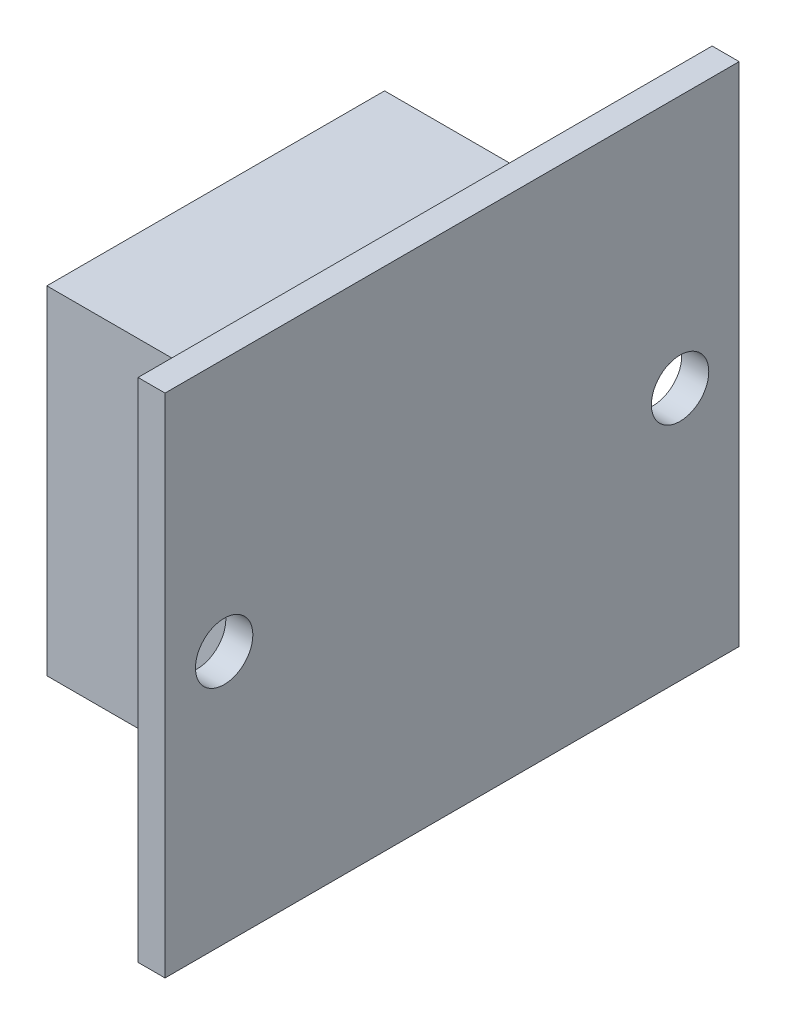
ISO-10303-21;
HEADER;
FILE_DESCRIPTION(('STEP AP214'),'2;1');
FILE_NAME('part.step','',(''),(''),'','','');
FILE_SCHEMA(('AUTOMOTIVE_DESIGN { 1 0 10303 214 1 1 1 1 }'));
ENDSEC;
DATA;
#1=APPLICATION_CONTEXT('core data for automotive mechanical design processes');
#2=APPLICATION_PROTOCOL_DEFINITION('international standard','automotive_design',2000,#1);
#3=PRODUCT_CONTEXT('',#1,'mechanical');
#4=PRODUCT('Part','Part','',(#3));
#5=PRODUCT_RELATED_PRODUCT_CATEGORY('part','',(#4));
#6=PRODUCT_DEFINITION_FORMATION('','',#4);
#7=PRODUCT_DEFINITION_CONTEXT('part definition',#1,'design');
#8=PRODUCT_DEFINITION('design','',#6,#7);
#9=PRODUCT_DEFINITION_SHAPE('','',#8);
#10=(LENGTH_UNIT() NAMED_UNIT(*) SI_UNIT(.MILLI.,.METRE.));
#11=(NAMED_UNIT(*) PLANE_ANGLE_UNIT() SI_UNIT($,.RADIAN.));
#12=(NAMED_UNIT(*) SI_UNIT($,.STERADIAN.) SOLID_ANGLE_UNIT());
#13=UNCERTAINTY_MEASURE_WITH_UNIT(LENGTH_MEASURE(1.E-05),#10,'distance_accuracy_value','');
#14=(GEOMETRIC_REPRESENTATION_CONTEXT(3) GLOBAL_UNCERTAINTY_ASSIGNED_CONTEXT((#13)) GLOBAL_UNIT_ASSIGNED_CONTEXT((#10,
#11,#12)) REPRESENTATION_CONTEXT('',''));
#15=CARTESIAN_POINT('',(0.,0.,0.));
#16=DIRECTION('',(0.,0.,1.));
#17=DIRECTION('',(1.,0.,0.));
#18=AXIS2_PLACEMENT_3D('',#15,#16,#17);
#19=CARTESIAN_POINT('',(-93.2,-60.,17.));
#20=DIRECTION('',(0.,-1.,0.));
#21=DIRECTION('',(0.,0.,-1.));
#22=AXIS2_PLACEMENT_3D('',#19,#20,#21);
#23=PLANE('',#22);
#24=DIRECTION('',(0.,0.,-1.));
#25=VECTOR('',#24,1.);
#26=CARTESIAN_POINT('',(-91.6,-60.,17.));
#27=LINE('',#26,#25);
#28=CARTESIAN_POINT('',(-91.6,-60.,17.));
#29=VERTEX_POINT('',#28);
#30=CARTESIAN_POINT('',(-91.6,-60.,-17.));
#31=VERTEX_POINT('',#30);
#32=EDGE_CURVE('E161',#29,#31,#27,.T.);
#33=ORIENTED_EDGE('',*,*,#32,.F.);
#34=DIRECTION('',(1.,0.,0.));
#35=VECTOR('',#34,1.);
#36=CARTESIAN_POINT('',(-93.2,-60.,17.));
#37=LINE('',#36,#35);
#38=CARTESIAN_POINT('',(-93.2,-60.,17.));
#39=VERTEX_POINT('',#38);
#40=EDGE_CURVE('E11',#39,#29,#37,.T.);
#41=ORIENTED_EDGE('',*,*,#40,.F.);
#42=DIRECTION('',(0.,0.,-1.));
#43=VECTOR('',#42,1.);
#44=CARTESIAN_POINT('',(-93.2,-60.,17.));
#45=LINE('',#44,#43);
#46=CARTESIAN_POINT('',(-93.2,-60.,-17.));
#47=VERTEX_POINT('',#46);
#48=EDGE_CURVE('E163',#39,#47,#45,.T.);
#49=ORIENTED_EDGE('',*,*,#48,.T.);
#50=DIRECTION('',(1.,0.,0.));
#51=VECTOR('',#50,1.);
#52=CARTESIAN_POINT('',(-93.2,-60.,-17.));
#53=LINE('',#52,#51);
#54=EDGE_CURVE('E42',#47,#31,#53,.T.);
#55=ORIENTED_EDGE('',*,*,#54,.T.);
#56=EDGE_LOOP('',(#33,#41,#49,#55));
#57=FACE_BOUND('',#56,.T.);
#58=ADVANCED_FACE('F41',(#57),#23,.T.);
#59=CARTESIAN_POINT('',(-93.2,-30.,17.));
#60=DIRECTION('',(0.,0.,1.));
#61=DIRECTION('',(1.,0.,0.));
#62=AXIS2_PLACEMENT_3D('',#59,#60,#61);
#63=PLANE('',#62);
#64=DIRECTION('',(0.,-1.,0.));
#65=VECTOR('',#64,1.);
#66=CARTESIAN_POINT('',(-91.6,-30.,17.));
#67=LINE('',#66,#65);
#68=CARTESIAN_POINT('',(-91.6,-30.,17.));
#69=VERTEX_POINT('',#68);
#70=EDGE_CURVE('E170',#69,#29,#67,.T.);
#71=ORIENTED_EDGE('',*,*,#70,.F.);
#72=DIRECTION('',(1.,0.,0.));
#73=VECTOR('',#72,1.);
#74=CARTESIAN_POINT('',(-93.2,-30.,17.));
#75=LINE('',#74,#73);
#76=CARTESIAN_POINT('',(-93.2,-30.,17.));
#77=VERTEX_POINT('',#76);
#78=EDGE_CURVE('E47',#77,#69,#75,.T.);
#79=ORIENTED_EDGE('',*,*,#78,.F.);
#80=DIRECTION('',(0.,-1.,0.));
#81=VECTOR('',#80,1.);
#82=CARTESIAN_POINT('',(-93.2,-30.,17.));
#83=LINE('',#82,#81);
#84=EDGE_CURVE('E174',#77,#39,#83,.T.);
#85=ORIENTED_EDGE('',*,*,#84,.T.);
#86=ORIENTED_EDGE('',*,*,#40,.T.);
#87=EDGE_LOOP('',(#71,#79,#85,#86));
#88=FACE_BOUND('',#87,.T.);
#89=ADVANCED_FACE('F186',(#88),#63,.T.);
#90=CARTESIAN_POINT('',(-93.2,-30.,-17.));
#91=DIRECTION('',(0.,1.,0.));
#92=DIRECTION('',(0.,0.,1.));
#93=AXIS2_PLACEMENT_3D('',#90,#91,#92);
#94=PLANE('',#93);
#95=DIRECTION('',(0.,0.,1.));
#96=VECTOR('',#95,1.);
#97=CARTESIAN_POINT('',(-91.6,-30.,-17.));
#98=LINE('',#97,#96);
#99=CARTESIAN_POINT('',(-91.6,-30.,-17.));
#100=VERTEX_POINT('',#99);
#101=EDGE_CURVE('E177',#100,#69,#98,.T.);
#102=ORIENTED_EDGE('',*,*,#101,.F.);
#103=DIRECTION('',(1.,0.,0.));
#104=VECTOR('',#103,1.);
#105=CARTESIAN_POINT('',(-93.2,-30.,-17.));
#106=LINE('',#105,#104);
#107=CARTESIAN_POINT('',(-93.2,-30.,-17.));
#108=VERTEX_POINT('',#107);
#109=EDGE_CURVE('E184',#108,#100,#106,.T.);
#110=ORIENTED_EDGE('',*,*,#109,.F.);
#111=DIRECTION('',(0.,0.,1.));
#112=VECTOR('',#111,1.);
#113=CARTESIAN_POINT('',(-93.2,-30.,-17.));
#114=LINE('',#113,#112);
#115=EDGE_CURVE('E166',#108,#77,#114,.T.);
#116=ORIENTED_EDGE('',*,*,#115,.T.);
#117=ORIENTED_EDGE('',*,*,#78,.T.);
#118=EDGE_LOOP('',(#102,#110,#116,#117));
#119=FACE_BOUND('',#118,.T.);
#120=ADVANCED_FACE('F193',(#119),#94,.T.);
#121=CARTESIAN_POINT('',(-93.2,-60.,-17.));
#122=DIRECTION('',(0.,0.,-1.));
#123=DIRECTION('',(-1.,0.,0.));
#124=AXIS2_PLACEMENT_3D('',#121,#122,#123);
#125=PLANE('',#124);
#126=DIRECTION('',(0.,1.,0.));
#127=VECTOR('',#126,1.);
#128=CARTESIAN_POINT('',(-91.6,-60.,-17.));
#129=LINE('',#128,#127);
#130=EDGE_CURVE('E176',#31,#100,#129,.T.);
#131=ORIENTED_EDGE('',*,*,#130,.F.);
#132=ORIENTED_EDGE('',*,*,#54,.F.);
#133=DIRECTION('',(0.,1.,0.));
#134=VECTOR('',#133,1.);
#135=CARTESIAN_POINT('',(-93.2,-60.,-17.));
#136=LINE('',#135,#134);
#137=EDGE_CURVE('E167',#47,#108,#136,.T.);
#138=ORIENTED_EDGE('',*,*,#137,.T.);
#139=ORIENTED_EDGE('',*,*,#109,.T.);
#140=EDGE_LOOP('',(#131,#132,#138,#139));
#141=FACE_BOUND('',#140,.T.);
#142=ADVANCED_FACE('F187',(#141),#125,.T.);
#143=CARTESIAN_POINT('',(-93.2,0.,0.));
#144=DIRECTION('',(1.,0.,0.));
#145=DIRECTION('',(0.,0.,-1.));
#146=AXIS2_PLACEMENT_3D('',#143,#144,#145);
#147=PLANE('',#146);
#148=DIRECTION('',(0.,-1.,0.));
#149=VECTOR('',#148,1.);
#150=CARTESIAN_POINT('',(-93.2,-35.,10.));
#151=LINE('',#150,#149);
#152=CARTESIAN_POINT('',(-93.2,-35.,10.));
#153=VERTEX_POINT('',#152);
#154=CARTESIAN_POINT('',(-93.2,-55.,10.));
#155=VERTEX_POINT('',#154);
#156=EDGE_CURVE('E133',#153,#155,#151,.T.);
#157=ORIENTED_EDGE('',*,*,#156,.T.);
#158=DIRECTION('',(0.,0.,-1.));
#159=VECTOR('',#158,1.);
#160=CARTESIAN_POINT('',(-93.2,-55.,10.));
#161=LINE('',#160,#159);
#162=CARTESIAN_POINT('',(-93.2,-55.,-10.));
#163=VERTEX_POINT('',#162);
#164=EDGE_CURVE('E60',#155,#163,#161,.T.);
#165=ORIENTED_EDGE('',*,*,#164,.T.);
#166=DIRECTION('',(0.,1.,0.));
#167=VECTOR('',#166,1.);
#168=CARTESIAN_POINT('',(-93.2,-55.,-10.));
#169=LINE('',#168,#167);
#170=CARTESIAN_POINT('',(-93.2,-35.,-10.));
#171=VERTEX_POINT('',#170);
#172=EDGE_CURVE('E120',#163,#171,#169,.T.);
#173=ORIENTED_EDGE('',*,*,#172,.T.);
#174=DIRECTION('',(0.,0.,1.));
#175=VECTOR('',#174,1.);
#176=CARTESIAN_POINT('',(-93.2,-35.,-10.));
#177=LINE('',#176,#175);
#178=EDGE_CURVE('E138',#171,#153,#177,.T.);
#179=ORIENTED_EDGE('',*,*,#178,.T.);
#180=EDGE_LOOP('',(#157,#165,#173,#179));
#181=FACE_BOUND('',#180,.T.);
#182=CARTESIAN_POINT('',(-93.2,-45.,13.5));
#183=DIRECTION('',(1.,0.,0.));
#184=DIRECTION('',(0.,0.,-1.));
#185=AXIS2_PLACEMENT_3D('',#182,#183,#184);
#186=CIRCLE('',#185,1.7);
#187=CARTESIAN_POINT('',(-93.2,-45.,11.8));
#188=VERTEX_POINT('',#187);
#189=EDGE_CURVE('E155',#188,#188,#186,.T.);
#190=ORIENTED_EDGE('',*,*,#189,.T.);
#191=EDGE_LOOP('',(#190));
#192=FACE_BOUND('',#191,.T.);
#193=CARTESIAN_POINT('',(-93.2,-45.,-13.5));
#194=DIRECTION('',(1.,0.,0.));
#195=DIRECTION('',(0.,0.,-1.));
#196=AXIS2_PLACEMENT_3D('',#193,#194,#195);
#197=CIRCLE('',#196,1.7);
#198=CARTESIAN_POINT('',(-93.2,-45.,-15.2));
#199=VERTEX_POINT('',#198);
#200=EDGE_CURVE('E158',#199,#199,#197,.T.);
#201=ORIENTED_EDGE('',*,*,#200,.T.);
#202=EDGE_LOOP('',(#201));
#203=FACE_BOUND('',#202,.T.);
#204=ORIENTED_EDGE('',*,*,#48,.F.);
#205=ORIENTED_EDGE('',*,*,#84,.F.);
#206=ORIENTED_EDGE('',*,*,#115,.F.);
#207=ORIENTED_EDGE('',*,*,#137,.F.);
#208=EDGE_LOOP('',(#204,#205,#206,#207));
#209=FACE_BOUND('',#208,.T.);
#210=ADVANCED_FACE('F194',(#181,#192,#203,#209),#147,.F.);
#211=CARTESIAN_POINT('',(-91.6,0.,0.));
#212=DIRECTION('',(1.,0.,0.));
#213=DIRECTION('',(0.,0.,-1.));
#214=AXIS2_PLACEMENT_3D('',#211,#212,#213);
#215=PLANE('',#214);
#216=CARTESIAN_POINT('',(-91.6,-45.,13.5));
#217=DIRECTION('',(1.,0.,0.));
#218=DIRECTION('',(0.,0.,-1.));
#219=AXIS2_PLACEMENT_3D('',#216,#217,#218);
#220=CIRCLE('',#219,1.7);
#221=CARTESIAN_POINT('',(-91.6,-45.,11.8));
#222=VERTEX_POINT('',#221);
#223=EDGE_CURVE('E146',#222,#222,#220,.T.);
#224=ORIENTED_EDGE('',*,*,#223,.F.);
#225=EDGE_LOOP('',(#224));
#226=FACE_BOUND('',#225,.T.);
#227=CARTESIAN_POINT('',(-91.6,-45.,-13.5));
#228=DIRECTION('',(1.,0.,0.));
#229=DIRECTION('',(0.,0.,-1.));
#230=AXIS2_PLACEMENT_3D('',#227,#228,#229);
#231=CIRCLE('',#230,1.7);
#232=CARTESIAN_POINT('',(-91.6,-45.,-15.2));
#233=VERTEX_POINT('',#232);
#234=EDGE_CURVE('E154',#233,#233,#231,.T.);
#235=ORIENTED_EDGE('',*,*,#234,.F.);
#236=EDGE_LOOP('',(#235));
#237=FACE_BOUND('',#236,.T.);
#238=ORIENTED_EDGE('',*,*,#32,.T.);
#239=ORIENTED_EDGE('',*,*,#130,.T.);
#240=ORIENTED_EDGE('',*,*,#101,.T.);
#241=ORIENTED_EDGE('',*,*,#70,.T.);
#242=EDGE_LOOP('',(#238,#239,#240,#241));
#243=FACE_BOUND('',#242,.T.);
#244=ADVANCED_FACE('F190',(#226,#237,#243),#215,.T.);
#245=CARTESIAN_POINT('',(-93.2,-45.,-13.5));
#246=DIRECTION('',(1.,0.,0.));
#247=DIRECTION('',(0.,0.,-1.));
#248=AXIS2_PLACEMENT_3D('',#245,#246,#247);
#249=CYLINDRICAL_SURFACE('',#248,1.7);
#250=ORIENTED_EDGE('',*,*,#200,.F.);
#251=EDGE_LOOP('',(#250));
#252=FACE_BOUND('',#251,.T.);
#253=ORIENTED_EDGE('',*,*,#234,.T.);
#254=EDGE_LOOP('',(#253));
#255=FACE_BOUND('',#254,.T.);
#256=ADVANCED_FACE('F204',(#252,#255),#249,.F.);
#257=CARTESIAN_POINT('',(-93.2,-45.,13.5));
#258=DIRECTION('',(1.,0.,0.));
#259=DIRECTION('',(0.,0.,-1.));
#260=AXIS2_PLACEMENT_3D('',#257,#258,#259);
#261=CYLINDRICAL_SURFACE('',#260,1.7);
#262=ORIENTED_EDGE('',*,*,#189,.F.);
#263=EDGE_LOOP('',(#262));
#264=FACE_BOUND('',#263,.T.);
#265=ORIENTED_EDGE('',*,*,#223,.T.);
#266=EDGE_LOOP('',(#265));
#267=FACE_BOUND('',#266,.T.);
#268=ADVANCED_FACE('F240',(#264,#267),#261,.F.);
#269=CARTESIAN_POINT('',(-105.6,-55.,10.));
#270=DIRECTION('',(0.,-1.,0.));
#271=DIRECTION('',(0.,0.,-1.));
#272=AXIS2_PLACEMENT_3D('',#269,#270,#271);
#273=PLANE('',#272);
#274=ORIENTED_EDGE('',*,*,#164,.F.);
#275=DIRECTION('',(1.,0.,0.));
#276=VECTOR('',#275,1.);
#277=CARTESIAN_POINT('',(-105.6,-55.,10.));
#278=LINE('',#277,#276);
#279=CARTESIAN_POINT('',(-105.6,-55.,10.));
#280=VERTEX_POINT('',#279);
#281=EDGE_CURVE('E131',#280,#155,#278,.T.);
#282=ORIENTED_EDGE('',*,*,#281,.F.);
#283=DIRECTION('',(0.,0.,-1.));
#284=VECTOR('',#283,1.);
#285=CARTESIAN_POINT('',(-105.6,-55.,10.));
#286=LINE('',#285,#284);
#287=CARTESIAN_POINT('',(-105.6,-55.,-10.));
#288=VERTEX_POINT('',#287);
#289=EDGE_CURVE('E126',#280,#288,#286,.T.);
#290=ORIENTED_EDGE('',*,*,#289,.T.);
#291=DIRECTION('',(1.,0.,0.));
#292=VECTOR('',#291,1.);
#293=CARTESIAN_POINT('',(-105.6,-55.,-10.));
#294=LINE('',#293,#292);
#295=EDGE_CURVE('E114',#288,#163,#294,.T.);
#296=ORIENTED_EDGE('',*,*,#295,.T.);
#297=EDGE_LOOP('',(#274,#282,#290,#296));
#298=FACE_BOUND('',#297,.T.);
#299=ADVANCED_FACE('F135',(#298),#273,.T.);
#300=CARTESIAN_POINT('',(-105.6,-35.,10.));
#301=DIRECTION('',(0.,0.,1.));
#302=DIRECTION('',(1.,0.,0.));
#303=AXIS2_PLACEMENT_3D('',#300,#301,#302);
#304=PLANE('',#303);
#305=ORIENTED_EDGE('',*,*,#156,.F.);
#306=DIRECTION('',(1.,0.,0.));
#307=VECTOR('',#306,1.);
#308=CARTESIAN_POINT('',(-105.6,-35.,10.));
#309=LINE('',#308,#307);
#310=CARTESIAN_POINT('',(-105.6,-35.,10.));
#311=VERTEX_POINT('',#310);
#312=EDGE_CURVE('E149',#311,#153,#309,.T.);
#313=ORIENTED_EDGE('',*,*,#312,.F.);
#314=DIRECTION('',(0.,-1.,0.));
#315=VECTOR('',#314,1.);
#316=CARTESIAN_POINT('',(-105.6,-35.,10.));
#317=LINE('',#316,#315);
#318=EDGE_CURVE('E121',#311,#280,#317,.T.);
#319=ORIENTED_EDGE('',*,*,#318,.T.);
#320=ORIENTED_EDGE('',*,*,#281,.T.);
#321=EDGE_LOOP('',(#305,#313,#319,#320));
#322=FACE_BOUND('',#321,.T.);
#323=ADVANCED_FACE('F254',(#322),#304,.T.);
#324=CARTESIAN_POINT('',(-105.6,-35.,-10.));
#325=DIRECTION('',(0.,1.,0.));
#326=DIRECTION('',(0.,0.,1.));
#327=AXIS2_PLACEMENT_3D('',#324,#325,#326);
#328=PLANE('',#327);
#329=ORIENTED_EDGE('',*,*,#178,.F.);
#330=DIRECTION('',(1.,0.,0.));
#331=VECTOR('',#330,1.);
#332=CARTESIAN_POINT('',(-105.6,-35.,-10.));
#333=LINE('',#332,#331);
#334=CARTESIAN_POINT('',(-105.6,-35.,-10.));
#335=VERTEX_POINT('',#334);
#336=EDGE_CURVE('E118',#335,#171,#333,.T.);
#337=ORIENTED_EDGE('',*,*,#336,.F.);
#338=DIRECTION('',(0.,0.,1.));
#339=VECTOR('',#338,1.);
#340=CARTESIAN_POINT('',(-105.6,-35.,-10.));
#341=LINE('',#340,#339);
#342=EDGE_CURVE('E132',#335,#311,#341,.T.);
#343=ORIENTED_EDGE('',*,*,#342,.T.);
#344=ORIENTED_EDGE('',*,*,#312,.T.);
#345=EDGE_LOOP('',(#329,#337,#343,#344));
#346=FACE_BOUND('',#345,.T.);
#347=ADVANCED_FACE('F262',(#346),#328,.T.);
#348=CARTESIAN_POINT('',(-105.6,-55.,-10.));
#349=DIRECTION('',(0.,0.,-1.));
#350=DIRECTION('',(-1.,0.,0.));
#351=AXIS2_PLACEMENT_3D('',#348,#349,#350);
#352=PLANE('',#351);
#353=ORIENTED_EDGE('',*,*,#172,.F.);
#354=ORIENTED_EDGE('',*,*,#295,.F.);
#355=DIRECTION('',(0.,1.,0.));
#356=VECTOR('',#355,1.);
#357=CARTESIAN_POINT('',(-105.6,-55.,-10.));
#358=LINE('',#357,#356);
#359=EDGE_CURVE('E117',#288,#335,#358,.T.);
#360=ORIENTED_EDGE('',*,*,#359,.T.);
#361=ORIENTED_EDGE('',*,*,#336,.T.);
#362=EDGE_LOOP('',(#353,#354,#360,#361));
#363=FACE_BOUND('',#362,.T.);
#364=ADVANCED_FACE('F113',(#363),#352,.T.);
#365=CARTESIAN_POINT('',(-105.6,0.,0.));
#366=DIRECTION('',(1.,0.,0.));
#367=DIRECTION('',(0.,0.,-1.));
#368=AXIS2_PLACEMENT_3D('',#365,#366,#367);
#369=PLANE('',#368);
#370=ORIENTED_EDGE('',*,*,#289,.F.);
#371=ORIENTED_EDGE('',*,*,#318,.F.);
#372=ORIENTED_EDGE('',*,*,#342,.F.);
#373=ORIENTED_EDGE('',*,*,#359,.F.);
#374=EDGE_LOOP('',(#370,#371,#372,#373));
#375=FACE_BOUND('',#374,.T.);
#376=ADVANCED_FACE('F127',(#375),#369,.F.);
#377=CLOSED_SHELL('',(#58,#89,#120,#142,#210,#244,#256,#268,#299,#323,#347,#364,#376));
#378=MANIFOLD_SOLID_BREP('B2',#377);
#379=ADVANCED_BREP_SHAPE_REPRESENTATION('',(#18,#378),#14);
#380=SHAPE_DEFINITION_REPRESENTATION(#9,#379);
ENDSEC;
END-ISO-10303-21;
